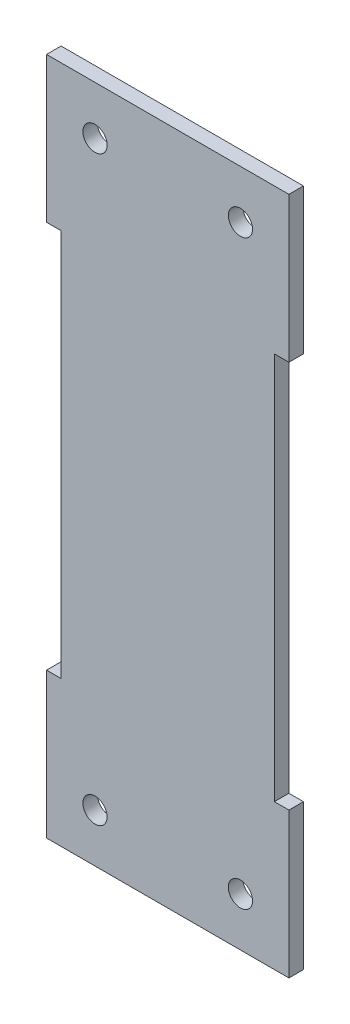
ISO-10303-21;
HEADER;
FILE_DESCRIPTION(('STEP AP214'),'2;1');
FILE_NAME('part.step','',(''),(''),'','','');
FILE_SCHEMA(('AUTOMOTIVE_DESIGN { 1 0 10303 214 1 1 1 1 }'));
ENDSEC;
DATA;
#1=APPLICATION_CONTEXT('core data for automotive mechanical design processes');
#2=APPLICATION_PROTOCOL_DEFINITION('international standard','automotive_design',2000,#1);
#3=PRODUCT_CONTEXT('',#1,'mechanical');
#4=PRODUCT('Part','Part','',(#3));
#5=PRODUCT_RELATED_PRODUCT_CATEGORY('part','',(#4));
#6=PRODUCT_DEFINITION_FORMATION('','',#4);
#7=PRODUCT_DEFINITION_CONTEXT('part definition',#1,'design');
#8=PRODUCT_DEFINITION('design','',#6,#7);
#9=PRODUCT_DEFINITION_SHAPE('','',#8);
#10=(LENGTH_UNIT() NAMED_UNIT(*) SI_UNIT(.MILLI.,.METRE.));
#11=(NAMED_UNIT(*) PLANE_ANGLE_UNIT() SI_UNIT($,.RADIAN.));
#12=(NAMED_UNIT(*) SI_UNIT($,.STERADIAN.) SOLID_ANGLE_UNIT());
#13=UNCERTAINTY_MEASURE_WITH_UNIT(LENGTH_MEASURE(1.E-05),#10,'distance_accuracy_value','');
#14=(GEOMETRIC_REPRESENTATION_CONTEXT(3) GLOBAL_UNCERTAINTY_ASSIGNED_CONTEXT((#13)) GLOBAL_UNIT_ASSIGNED_CONTEXT((#10,
#11,#12)) REPRESENTATION_CONTEXT('',''));
#15=CARTESIAN_POINT('',(0.,0.,0.));
#16=DIRECTION('',(0.,0.,1.));
#17=DIRECTION('',(1.,0.,0.));
#18=AXIS2_PLACEMENT_3D('',#15,#16,#17);
#19=CARTESIAN_POINT('',(0.,0.,3.));
#20=DIRECTION('',(0.,0.,1.));
#21=DIRECTION('',(1.,0.,0.));
#22=AXIS2_PLACEMENT_3D('',#19,#20,#21);
#23=PLANE('',#22);
#24=CARTESIAN_POINT('',(15.,-60.,3.));
#25=DIRECTION('',(0.,0.,1.));
#26=DIRECTION('',(-1.,0.,0.));
#27=AXIS2_PLACEMENT_3D('',#24,#25,#26);
#28=CIRCLE('',#27,2.5);
#29=CARTESIAN_POINT('',(12.5,-60.,3.));
#30=VERTEX_POINT('',#29);
#31=EDGE_CURVE('E332',#30,#30,#28,.T.);
#32=ORIENTED_EDGE('',*,*,#31,.F.);
#33=EDGE_LOOP('',(#32));
#34=FACE_BOUND('',#33,.T.);
#35=CARTESIAN_POINT('',(-15.,60.,3.));
#36=DIRECTION('',(0.,0.,1.));
#37=DIRECTION('',(1.,0.,0.));
#38=AXIS2_PLACEMENT_3D('',#35,#36,#37);
#39=CIRCLE('',#38,2.5);
#40=CARTESIAN_POINT('',(-12.5,60.,3.));
#41=VERTEX_POINT('',#40);
#42=EDGE_CURVE('E170',#41,#41,#39,.T.);
#43=ORIENTED_EDGE('',*,*,#42,.F.);
#44=EDGE_LOOP('',(#43));
#45=FACE_BOUND('',#44,.T.);
#46=DIRECTION('',(0.,-1.,0.));
#47=VECTOR('',#46,1.);
#48=CARTESIAN_POINT('',(-25.,40.,3.));
#49=LINE('',#48,#47);
#50=CARTESIAN_POINT('',(-25.,70.,3.));
#51=VERTEX_POINT('',#50);
#52=CARTESIAN_POINT('',(-25.,40.,3.));
#53=VERTEX_POINT('',#52);
#54=EDGE_CURVE('E200',#51,#53,#49,.T.);
#55=ORIENTED_EDGE('',*,*,#54,.T.);
#56=DIRECTION('',(1.,0.,0.));
#57=VECTOR('',#56,1.);
#58=CARTESIAN_POINT('',(-25.,40.,3.));
#59=LINE('',#58,#57);
#60=CARTESIAN_POINT('',(-22.,40.,3.));
#61=VERTEX_POINT('',#60);
#62=EDGE_CURVE('E112',#53,#61,#59,.T.);
#63=ORIENTED_EDGE('',*,*,#62,.T.);
#64=DIRECTION('',(0.,-1.,0.));
#65=VECTOR('',#64,1.);
#66=CARTESIAN_POINT('',(-22.,40.,3.));
#67=LINE('',#66,#65);
#68=CARTESIAN_POINT('',(-22.,-40.,3.));
#69=VERTEX_POINT('',#68);
#70=EDGE_CURVE('E237',#61,#69,#67,.T.);
#71=ORIENTED_EDGE('',*,*,#70,.T.);
#72=DIRECTION('',(-1.,0.,0.));
#73=VECTOR('',#72,1.);
#74=CARTESIAN_POINT('',(-22.,-40.,3.));
#75=LINE('',#74,#73);
#76=CARTESIAN_POINT('',(-25.,-40.,3.));
#77=VERTEX_POINT('',#76);
#78=EDGE_CURVE('E257',#69,#77,#75,.T.);
#79=ORIENTED_EDGE('',*,*,#78,.T.);
#80=DIRECTION('',(0.,-1.,0.));
#81=VECTOR('',#80,1.);
#82=CARTESIAN_POINT('',(-25.,-70.,3.));
#83=LINE('',#82,#81);
#84=CARTESIAN_POINT('',(-25.,-70.,3.));
#85=VERTEX_POINT('',#84);
#86=EDGE_CURVE('E253',#77,#85,#83,.T.);
#87=ORIENTED_EDGE('',*,*,#86,.T.);
#88=DIRECTION('',(1.,0.,0.));
#89=VECTOR('',#88,1.);
#90=CARTESIAN_POINT('',(25.,-70.,3.));
#91=LINE('',#90,#89);
#92=CARTESIAN_POINT('',(25.,-70.,3.));
#93=VERTEX_POINT('',#92);
#94=EDGE_CURVE('E256',#85,#93,#91,.T.);
#95=ORIENTED_EDGE('',*,*,#94,.T.);
#96=DIRECTION('',(0.,1.,0.));
#97=VECTOR('',#96,1.);
#98=CARTESIAN_POINT('',(25.,-70.,3.));
#99=LINE('',#98,#97);
#100=CARTESIAN_POINT('',(25.,-40.,3.));
#101=VERTEX_POINT('',#100);
#102=EDGE_CURVE('E261',#93,#101,#99,.T.);
#103=ORIENTED_EDGE('',*,*,#102,.T.);
#104=DIRECTION('',(-1.,0.,0.));
#105=VECTOR('',#104,1.);
#106=CARTESIAN_POINT('',(22.,-40.,3.));
#107=LINE('',#106,#105);
#108=CARTESIAN_POINT('',(22.,-40.,3.));
#109=VERTEX_POINT('',#108);
#110=EDGE_CURVE('E268',#101,#109,#107,.T.);
#111=ORIENTED_EDGE('',*,*,#110,.T.);
#112=DIRECTION('',(0.,1.,0.));
#113=VECTOR('',#112,1.);
#114=CARTESIAN_POINT('',(22.,40.,3.));
#115=LINE('',#114,#113);
#116=CARTESIAN_POINT('',(22.,40.,3.));
#117=VERTEX_POINT('',#116);
#118=EDGE_CURVE('E143',#109,#117,#115,.T.);
#119=ORIENTED_EDGE('',*,*,#118,.T.);
#120=DIRECTION('',(1.,0.,0.));
#121=VECTOR('',#120,1.);
#122=CARTESIAN_POINT('',(25.,40.,3.));
#123=LINE('',#122,#121);
#124=CARTESIAN_POINT('',(25.,40.,3.));
#125=VERTEX_POINT('',#124);
#126=EDGE_CURVE('E137',#117,#125,#123,.T.);
#127=ORIENTED_EDGE('',*,*,#126,.T.);
#128=DIRECTION('',(0.,1.,0.));
#129=VECTOR('',#128,1.);
#130=CARTESIAN_POINT('',(25.,40.,3.));
#131=LINE('',#130,#129);
#132=CARTESIAN_POINT('',(25.,70.,3.));
#133=VERTEX_POINT('',#132);
#134=EDGE_CURVE('E141',#125,#133,#131,.T.);
#135=ORIENTED_EDGE('',*,*,#134,.T.);
#136=DIRECTION('',(-1.,0.,0.));
#137=VECTOR('',#136,1.);
#138=CARTESIAN_POINT('',(25.,70.,3.));
#139=LINE('',#138,#137);
#140=EDGE_CURVE('E57',#133,#51,#139,.T.);
#141=ORIENTED_EDGE('',*,*,#140,.T.);
#142=EDGE_LOOP('',(#55,#63,#71,#79,#87,#95,#103,#111,#119,#127,#135,#141));
#143=FACE_BOUND('',#142,.T.);
#144=CARTESIAN_POINT('',(15.,60.,3.));
#145=DIRECTION('',(0.,0.,1.));
#146=DIRECTION('',(1.,0.,0.));
#147=AXIS2_PLACEMENT_3D('',#144,#145,#146);
#148=CIRCLE('',#147,2.5);
#149=CARTESIAN_POINT('',(17.5,60.,3.));
#150=VERTEX_POINT('',#149);
#151=EDGE_CURVE('E340',#150,#150,#148,.T.);
#152=ORIENTED_EDGE('',*,*,#151,.F.);
#153=EDGE_LOOP('',(#152));
#154=FACE_BOUND('',#153,.T.);
#155=CARTESIAN_POINT('',(-15.,-60.,3.));
#156=DIRECTION('',(0.,0.,1.));
#157=DIRECTION('',(-1.,0.,0.));
#158=AXIS2_PLACEMENT_3D('',#155,#156,#157);
#159=CIRCLE('',#158,2.5);
#160=CARTESIAN_POINT('',(-17.5,-60.,3.));
#161=VERTEX_POINT('',#160);
#162=EDGE_CURVE('E321',#161,#161,#159,.T.);
#163=ORIENTED_EDGE('',*,*,#162,.F.);
#164=EDGE_LOOP('',(#163));
#165=FACE_BOUND('',#164,.T.);
#166=ADVANCED_FACE('F39',(#34,#45,#143,#154,#165),#23,.T.);
#167=CARTESIAN_POINT('',(0.,0.,0.));
#168=DIRECTION('',(0.,0.,1.));
#169=DIRECTION('',(1.,0.,0.));
#170=AXIS2_PLACEMENT_3D('',#167,#168,#169);
#171=PLANE('',#170);
#172=DIRECTION('',(0.,-1.,0.));
#173=VECTOR('',#172,1.);
#174=CARTESIAN_POINT('',(-25.,40.,0.));
#175=LINE('',#174,#173);
#176=CARTESIAN_POINT('',(-25.,70.,0.));
#177=VERTEX_POINT('',#176);
#178=CARTESIAN_POINT('',(-25.,40.,0.));
#179=VERTEX_POINT('',#178);
#180=EDGE_CURVE('E165',#177,#179,#175,.T.);
#181=ORIENTED_EDGE('',*,*,#180,.F.);
#182=DIRECTION('',(-1.,0.,0.));
#183=VECTOR('',#182,1.);
#184=CARTESIAN_POINT('',(25.,70.,0.));
#185=LINE('',#184,#183);
#186=CARTESIAN_POINT('',(25.,70.,0.));
#187=VERTEX_POINT('',#186);
#188=EDGE_CURVE('E104',#187,#177,#185,.T.);
#189=ORIENTED_EDGE('',*,*,#188,.F.);
#190=DIRECTION('',(0.,1.,0.));
#191=VECTOR('',#190,1.);
#192=CARTESIAN_POINT('',(25.,40.,0.));
#193=LINE('',#192,#191);
#194=CARTESIAN_POINT('',(25.,40.,0.));
#195=VERTEX_POINT('',#194);
#196=EDGE_CURVE('E98',#195,#187,#193,.T.);
#197=ORIENTED_EDGE('',*,*,#196,.F.);
#198=DIRECTION('',(1.,0.,0.));
#199=VECTOR('',#198,1.);
#200=CARTESIAN_POINT('',(25.,40.,0.));
#201=LINE('',#200,#199);
#202=CARTESIAN_POINT('',(22.,40.,0.));
#203=VERTEX_POINT('',#202);
#204=EDGE_CURVE('E152',#203,#195,#201,.T.);
#205=ORIENTED_EDGE('',*,*,#204,.F.);
#206=DIRECTION('',(0.,1.,0.));
#207=VECTOR('',#206,1.);
#208=CARTESIAN_POINT('',(22.,40.,0.));
#209=LINE('',#208,#207);
#210=CARTESIAN_POINT('',(22.,-40.,0.));
#211=VERTEX_POINT('',#210);
#212=EDGE_CURVE('E191',#211,#203,#209,.T.);
#213=ORIENTED_EDGE('',*,*,#212,.F.);
#214=DIRECTION('',(-1.,0.,0.));
#215=VECTOR('',#214,1.);
#216=CARTESIAN_POINT('',(22.,-40.,0.));
#217=LINE('',#216,#215);
#218=CARTESIAN_POINT('',(25.,-40.,0.));
#219=VERTEX_POINT('',#218);
#220=EDGE_CURVE('E188',#219,#211,#217,.T.);
#221=ORIENTED_EDGE('',*,*,#220,.F.);
#222=DIRECTION('',(0.,1.,0.));
#223=VECTOR('',#222,1.);
#224=CARTESIAN_POINT('',(25.,-70.,0.));
#225=LINE('',#224,#223);
#226=CARTESIAN_POINT('',(25.,-70.,0.));
#227=VERTEX_POINT('',#226);
#228=EDGE_CURVE('E185',#227,#219,#225,.T.);
#229=ORIENTED_EDGE('',*,*,#228,.F.);
#230=DIRECTION('',(1.,0.,0.));
#231=VECTOR('',#230,1.);
#232=CARTESIAN_POINT('',(25.,-70.,0.));
#233=LINE('',#232,#231);
#234=CARTESIAN_POINT('',(-25.,-70.,0.));
#235=VERTEX_POINT('',#234);
#236=EDGE_CURVE('E182',#235,#227,#233,.T.);
#237=ORIENTED_EDGE('',*,*,#236,.F.);
#238=DIRECTION('',(0.,-1.,0.));
#239=VECTOR('',#238,1.);
#240=CARTESIAN_POINT('',(-25.,-70.,0.));
#241=LINE('',#240,#239);
#242=CARTESIAN_POINT('',(-25.,-40.,0.));
#243=VERTEX_POINT('',#242);
#244=EDGE_CURVE('E179',#243,#235,#241,.T.);
#245=ORIENTED_EDGE('',*,*,#244,.F.);
#246=DIRECTION('',(-1.,0.,0.));
#247=VECTOR('',#246,1.);
#248=CARTESIAN_POINT('',(-22.,-40.,0.));
#249=LINE('',#248,#247);
#250=CARTESIAN_POINT('',(-22.,-40.,0.));
#251=VERTEX_POINT('',#250);
#252=EDGE_CURVE('E176',#251,#243,#249,.T.);
#253=ORIENTED_EDGE('',*,*,#252,.F.);
#254=DIRECTION('',(0.,-1.,0.));
#255=VECTOR('',#254,1.);
#256=CARTESIAN_POINT('',(-22.,40.,0.));
#257=LINE('',#256,#255);
#258=CARTESIAN_POINT('',(-22.,40.,0.));
#259=VERTEX_POINT('',#258);
#260=EDGE_CURVE('E173',#259,#251,#257,.T.);
#261=ORIENTED_EDGE('',*,*,#260,.F.);
#262=DIRECTION('',(1.,0.,0.));
#263=VECTOR('',#262,1.);
#264=CARTESIAN_POINT('',(-25.,40.,0.));
#265=LINE('',#264,#263);
#266=EDGE_CURVE('E169',#179,#259,#265,.T.);
#267=ORIENTED_EDGE('',*,*,#266,.F.);
#268=EDGE_LOOP('',(#181,#189,#197,#205,#213,#221,#229,#237,#245,#253,#261,#267));
#269=FACE_BOUND('',#268,.T.);
#270=CARTESIAN_POINT('',(-15.,60.,0.));
#271=DIRECTION('',(0.,0.,1.));
#272=DIRECTION('',(1.,0.,0.));
#273=AXIS2_PLACEMENT_3D('',#270,#271,#272);
#274=CIRCLE('',#273,2.5);
#275=CARTESIAN_POINT('',(-12.5,60.,0.));
#276=VERTEX_POINT('',#275);
#277=EDGE_CURVE('E344',#276,#276,#274,.T.);
#278=ORIENTED_EDGE('',*,*,#277,.T.);
#279=EDGE_LOOP('',(#278));
#280=FACE_BOUND('',#279,.T.);
#281=CARTESIAN_POINT('',(15.,60.,0.));
#282=DIRECTION('',(0.,0.,1.));
#283=DIRECTION('',(1.,0.,0.));
#284=AXIS2_PLACEMENT_3D('',#281,#282,#283);
#285=CIRCLE('',#284,2.5);
#286=CARTESIAN_POINT('',(17.5,60.,0.));
#287=VERTEX_POINT('',#286);
#288=EDGE_CURVE('E336',#287,#287,#285,.T.);
#289=ORIENTED_EDGE('',*,*,#288,.T.);
#290=EDGE_LOOP('',(#289));
#291=FACE_BOUND('',#290,.T.);
#292=CARTESIAN_POINT('',(15.,-60.,0.));
#293=DIRECTION('',(0.,0.,1.));
#294=DIRECTION('',(-1.,0.,0.));
#295=AXIS2_PLACEMENT_3D('',#292,#293,#294);
#296=CIRCLE('',#295,2.5);
#297=CARTESIAN_POINT('',(12.5,-60.,0.));
#298=VERTEX_POINT('',#297);
#299=EDGE_CURVE('E329',#298,#298,#296,.T.);
#300=ORIENTED_EDGE('',*,*,#299,.T.);
#301=EDGE_LOOP('',(#300));
#302=FACE_BOUND('',#301,.T.);
#303=CARTESIAN_POINT('',(-15.,-60.,0.));
#304=DIRECTION('',(0.,0.,1.));
#305=DIRECTION('',(-1.,0.,0.));
#306=AXIS2_PLACEMENT_3D('',#303,#304,#305);
#307=CIRCLE('',#306,2.5);
#308=CARTESIAN_POINT('',(-17.5,-60.,0.));
#309=VERTEX_POINT('',#308);
#310=EDGE_CURVE('E324',#309,#309,#307,.T.);
#311=ORIENTED_EDGE('',*,*,#310,.T.);
#312=EDGE_LOOP('',(#311));
#313=FACE_BOUND('',#312,.T.);
#314=ADVANCED_FACE('F241',(#269,#280,#291,#302,#313),#171,.F.);
#315=CARTESIAN_POINT('',(-25.,40.,3.));
#316=DIRECTION('',(1.,0.,0.));
#317=DIRECTION('',(0.,0.,-1.));
#318=AXIS2_PLACEMENT_3D('',#315,#316,#317);
#319=PLANE('',#318);
#320=ORIENTED_EDGE('',*,*,#180,.T.);
#321=DIRECTION('',(0.,0.,-1.));
#322=VECTOR('',#321,1.);
#323=CARTESIAN_POINT('',(-25.,40.,3.));
#324=LINE('',#323,#322);
#325=EDGE_CURVE('E11',#53,#179,#324,.T.);
#326=ORIENTED_EDGE('',*,*,#325,.F.);
#327=ORIENTED_EDGE('',*,*,#54,.F.);
#328=DIRECTION('',(0.,0.,-1.));
#329=VECTOR('',#328,1.);
#330=CARTESIAN_POINT('',(-25.,70.,3.));
#331=LINE('',#330,#329);
#332=EDGE_CURVE('E161',#51,#177,#331,.T.);
#333=ORIENTED_EDGE('',*,*,#332,.T.);
#334=EDGE_LOOP('',(#320,#326,#327,#333));
#335=FACE_BOUND('',#334,.T.);
#336=ADVANCED_FACE('F41',(#335),#319,.F.);
#337=CARTESIAN_POINT('',(-25.,40.,3.));
#338=DIRECTION('',(0.,1.,0.));
#339=DIRECTION('',(0.,0.,1.));
#340=AXIS2_PLACEMENT_3D('',#337,#338,#339);
#341=PLANE('',#340);
#342=ORIENTED_EDGE('',*,*,#266,.T.);
#343=DIRECTION('',(0.,0.,-1.));
#344=VECTOR('',#343,1.);
#345=CARTESIAN_POINT('',(-22.,40.,3.));
#346=LINE('',#345,#344);
#347=EDGE_CURVE('E49',#61,#259,#346,.T.);
#348=ORIENTED_EDGE('',*,*,#347,.F.);
#349=ORIENTED_EDGE('',*,*,#62,.F.);
#350=ORIENTED_EDGE('',*,*,#325,.T.);
#351=EDGE_LOOP('',(#342,#348,#349,#350));
#352=FACE_BOUND('',#351,.T.);
#353=ADVANCED_FACE('F460',(#352),#341,.F.);
#354=CARTESIAN_POINT('',(-22.,40.,3.));
#355=DIRECTION('',(1.,0.,0.));
#356=DIRECTION('',(0.,1.,0.));
#357=AXIS2_PLACEMENT_3D('',#354,#355,#356);
#358=PLANE('',#357);
#359=ORIENTED_EDGE('',*,*,#260,.T.);
#360=DIRECTION('',(0.,0.,-1.));
#361=VECTOR('',#360,1.);
#362=CARTESIAN_POINT('',(-22.,-40.,3.));
#363=LINE('',#362,#361);
#364=EDGE_CURVE('E227',#69,#251,#363,.T.);
#365=ORIENTED_EDGE('',*,*,#364,.F.);
#366=ORIENTED_EDGE('',*,*,#70,.F.);
#367=ORIENTED_EDGE('',*,*,#347,.T.);
#368=EDGE_LOOP('',(#359,#365,#366,#367));
#369=FACE_BOUND('',#368,.T.);
#370=ADVANCED_FACE('F235',(#369),#358,.F.);
#371=CARTESIAN_POINT('',(-22.,-40.,3.));
#372=DIRECTION('',(0.,-1.,0.));
#373=DIRECTION('',(0.,0.,-1.));
#374=AXIS2_PLACEMENT_3D('',#371,#372,#373);
#375=PLANE('',#374);
#376=ORIENTED_EDGE('',*,*,#252,.T.);
#377=DIRECTION('',(0.,0.,-1.));
#378=VECTOR('',#377,1.);
#379=CARTESIAN_POINT('',(-25.,-40.,3.));
#380=LINE('',#379,#378);
#381=EDGE_CURVE('E223',#77,#243,#380,.T.);
#382=ORIENTED_EDGE('',*,*,#381,.F.);
#383=ORIENTED_EDGE('',*,*,#78,.F.);
#384=ORIENTED_EDGE('',*,*,#364,.T.);
#385=EDGE_LOOP('',(#376,#382,#383,#384));
#386=FACE_BOUND('',#385,.T.);
#387=ADVANCED_FACE('F247',(#386),#375,.F.);
#388=CARTESIAN_POINT('',(-25.,-70.,3.));
#389=DIRECTION('',(1.,0.,0.));
#390=DIRECTION('',(0.,0.,-1.));
#391=AXIS2_PLACEMENT_3D('',#388,#389,#390);
#392=PLANE('',#391);
#393=ORIENTED_EDGE('',*,*,#244,.T.);
#394=DIRECTION('',(0.,0.,-1.));
#395=VECTOR('',#394,1.);
#396=CARTESIAN_POINT('',(-25.,-70.,3.));
#397=LINE('',#396,#395);
#398=EDGE_CURVE('E219',#85,#235,#397,.T.);
#399=ORIENTED_EDGE('',*,*,#398,.F.);
#400=ORIENTED_EDGE('',*,*,#86,.F.);
#401=ORIENTED_EDGE('',*,*,#381,.T.);
#402=EDGE_LOOP('',(#393,#399,#400,#401));
#403=FACE_BOUND('',#402,.T.);
#404=ADVANCED_FACE('F251',(#403),#392,.F.);
#405=CARTESIAN_POINT('',(25.,-70.,3.));
#406=DIRECTION('',(0.,1.,0.));
#407=DIRECTION('',(-1.,0.,0.));
#408=AXIS2_PLACEMENT_3D('',#405,#406,#407);
#409=PLANE('',#408);
#410=ORIENTED_EDGE('',*,*,#236,.T.);
#411=DIRECTION('',(0.,0.,-1.));
#412=VECTOR('',#411,1.);
#413=CARTESIAN_POINT('',(25.,-70.,3.));
#414=LINE('',#413,#412);
#415=EDGE_CURVE('E215',#93,#227,#414,.T.);
#416=ORIENTED_EDGE('',*,*,#415,.F.);
#417=ORIENTED_EDGE('',*,*,#94,.F.);
#418=ORIENTED_EDGE('',*,*,#398,.T.);
#419=EDGE_LOOP('',(#410,#416,#417,#418));
#420=FACE_BOUND('',#419,.T.);
#421=ADVANCED_FACE('F425',(#420),#409,.F.);
#422=CARTESIAN_POINT('',(25.,-70.,3.));
#423=DIRECTION('',(-1.,0.,0.));
#424=DIRECTION('',(0.,0.,1.));
#425=AXIS2_PLACEMENT_3D('',#422,#423,#424);
#426=PLANE('',#425);
#427=ORIENTED_EDGE('',*,*,#228,.T.);
#428=DIRECTION('',(0.,0.,-1.));
#429=VECTOR('',#428,1.);
#430=CARTESIAN_POINT('',(25.,-40.,3.));
#431=LINE('',#430,#429);
#432=EDGE_CURVE('E211',#101,#219,#431,.T.);
#433=ORIENTED_EDGE('',*,*,#432,.F.);
#434=ORIENTED_EDGE('',*,*,#102,.F.);
#435=ORIENTED_EDGE('',*,*,#415,.T.);
#436=EDGE_LOOP('',(#427,#433,#434,#435));
#437=FACE_BOUND('',#436,.T.);
#438=ADVANCED_FACE('F416',(#437),#426,.F.);
#439=CARTESIAN_POINT('',(22.,-40.,3.));
#440=DIRECTION('',(0.,-1.,0.));
#441=DIRECTION('',(0.,0.,-1.));
#442=AXIS2_PLACEMENT_3D('',#439,#440,#441);
#443=PLANE('',#442);
#444=ORIENTED_EDGE('',*,*,#220,.T.);
#445=DIRECTION('',(0.,0.,-1.));
#446=VECTOR('',#445,1.);
#447=CARTESIAN_POINT('',(22.,-40.,3.));
#448=LINE('',#447,#446);
#449=EDGE_CURVE('E207',#109,#211,#448,.T.);
#450=ORIENTED_EDGE('',*,*,#449,.F.);
#451=ORIENTED_EDGE('',*,*,#110,.F.);
#452=ORIENTED_EDGE('',*,*,#432,.T.);
#453=EDGE_LOOP('',(#444,#450,#451,#452));
#454=FACE_BOUND('',#453,.T.);
#455=ADVANCED_FACE('F276',(#454),#443,.F.);
#456=CARTESIAN_POINT('',(22.,40.,3.));
#457=DIRECTION('',(-1.,0.,0.));
#458=DIRECTION('',(0.,-1.,0.));
#459=AXIS2_PLACEMENT_3D('',#456,#457,#458);
#460=PLANE('',#459);
#461=ORIENTED_EDGE('',*,*,#212,.T.);
#462=DIRECTION('',(0.,0.,-1.));
#463=VECTOR('',#462,1.);
#464=CARTESIAN_POINT('',(22.,40.,3.));
#465=LINE('',#464,#463);
#466=EDGE_CURVE('E154',#117,#203,#465,.T.);
#467=ORIENTED_EDGE('',*,*,#466,.F.);
#468=ORIENTED_EDGE('',*,*,#118,.F.);
#469=ORIENTED_EDGE('',*,*,#449,.T.);
#470=EDGE_LOOP('',(#461,#467,#468,#469));
#471=FACE_BOUND('',#470,.T.);
#472=ADVANCED_FACE('F280',(#471),#460,.F.);
#473=CARTESIAN_POINT('',(25.,40.,3.));
#474=DIRECTION('',(0.,1.,0.));
#475=DIRECTION('',(0.,0.,1.));
#476=AXIS2_PLACEMENT_3D('',#473,#474,#475);
#477=PLANE('',#476);
#478=ORIENTED_EDGE('',*,*,#204,.T.);
#479=DIRECTION('',(0.,0.,-1.));
#480=VECTOR('',#479,1.);
#481=CARTESIAN_POINT('',(25.,40.,3.));
#482=LINE('',#481,#480);
#483=EDGE_CURVE('E149',#125,#195,#482,.T.);
#484=ORIENTED_EDGE('',*,*,#483,.F.);
#485=ORIENTED_EDGE('',*,*,#126,.F.);
#486=ORIENTED_EDGE('',*,*,#466,.T.);
#487=EDGE_LOOP('',(#478,#484,#485,#486));
#488=FACE_BOUND('',#487,.T.);
#489=ADVANCED_FACE('F150',(#488),#477,.F.);
#490=CARTESIAN_POINT('',(25.,40.,3.));
#491=DIRECTION('',(-1.,0.,0.));
#492=DIRECTION('',(0.,0.,1.));
#493=AXIS2_PLACEMENT_3D('',#490,#491,#492);
#494=PLANE('',#493);
#495=ORIENTED_EDGE('',*,*,#196,.T.);
#496=DIRECTION('',(0.,0.,-1.));
#497=VECTOR('',#496,1.);
#498=CARTESIAN_POINT('',(25.,70.,3.));
#499=LINE('',#498,#497);
#500=EDGE_CURVE('E155',#133,#187,#499,.T.);
#501=ORIENTED_EDGE('',*,*,#500,.F.);
#502=ORIENTED_EDGE('',*,*,#134,.F.);
#503=ORIENTED_EDGE('',*,*,#483,.T.);
#504=EDGE_LOOP('',(#495,#501,#502,#503));
#505=FACE_BOUND('',#504,.T.);
#506=ADVANCED_FACE('F157',(#505),#494,.F.);
#507=CARTESIAN_POINT('',(25.,70.,3.));
#508=DIRECTION('',(0.,-1.,0.));
#509=DIRECTION('',(0.,0.,-1.));
#510=AXIS2_PLACEMENT_3D('',#507,#508,#509);
#511=PLANE('',#510);
#512=ORIENTED_EDGE('',*,*,#188,.T.);
#513=ORIENTED_EDGE('',*,*,#332,.F.);
#514=ORIENTED_EDGE('',*,*,#140,.F.);
#515=ORIENTED_EDGE('',*,*,#500,.T.);
#516=EDGE_LOOP('',(#512,#513,#514,#515));
#517=FACE_BOUND('',#516,.T.);
#518=ADVANCED_FACE('F284',(#517),#511,.F.);
#519=CARTESIAN_POINT('',(-15.,60.,3.));
#520=DIRECTION('',(0.,0.,-1.));
#521=DIRECTION('',(-1.,0.,0.));
#522=AXIS2_PLACEMENT_3D('',#519,#520,#521);
#523=CYLINDRICAL_SURFACE('',#522,2.5);
#524=ORIENTED_EDGE('',*,*,#42,.T.);
#525=EDGE_LOOP('',(#524));
#526=FACE_BOUND('',#525,.T.);
#527=ORIENTED_EDGE('',*,*,#277,.F.);
#528=EDGE_LOOP('',(#527));
#529=FACE_BOUND('',#528,.T.);
#530=ADVANCED_FACE('F286',(#526,#529),#523,.F.);
#531=CARTESIAN_POINT('',(15.,60.,3.));
#532=DIRECTION('',(0.,0.,-1.));
#533=DIRECTION('',(-1.,0.,0.));
#534=AXIS2_PLACEMENT_3D('',#531,#532,#533);
#535=CYLINDRICAL_SURFACE('',#534,2.5);
#536=ORIENTED_EDGE('',*,*,#151,.T.);
#537=EDGE_LOOP('',(#536));
#538=FACE_BOUND('',#537,.T.);
#539=ORIENTED_EDGE('',*,*,#288,.F.);
#540=EDGE_LOOP('',(#539));
#541=FACE_BOUND('',#540,.T.);
#542=ADVANCED_FACE('F292',(#538,#541),#535,.F.);
#543=CARTESIAN_POINT('',(15.,-60.,3.));
#544=DIRECTION('',(0.,0.,-1.));
#545=DIRECTION('',(-1.,0.,0.));
#546=AXIS2_PLACEMENT_3D('',#543,#544,#545);
#547=CYLINDRICAL_SURFACE('',#546,2.5);
#548=ORIENTED_EDGE('',*,*,#31,.T.);
#549=EDGE_LOOP('',(#548));
#550=FACE_BOUND('',#549,.T.);
#551=ORIENTED_EDGE('',*,*,#299,.F.);
#552=EDGE_LOOP('',(#551));
#553=FACE_BOUND('',#552,.T.);
#554=ADVANCED_FACE('F308',(#550,#553),#547,.F.);
#555=CARTESIAN_POINT('',(-15.,-60.,3.));
#556=DIRECTION('',(0.,0.,-1.));
#557=DIRECTION('',(-1.,0.,0.));
#558=AXIS2_PLACEMENT_3D('',#555,#556,#557);
#559=CYLINDRICAL_SURFACE('',#558,2.5);
#560=ORIENTED_EDGE('',*,*,#162,.T.);
#561=EDGE_LOOP('',(#560));
#562=FACE_BOUND('',#561,.T.);
#563=ORIENTED_EDGE('',*,*,#310,.F.);
#564=EDGE_LOOP('',(#563));
#565=FACE_BOUND('',#564,.T.);
#566=ADVANCED_FACE('F312',(#562,#565),#559,.F.);
#567=CLOSED_SHELL('',(#166,#314,#336,#353,#370,#387,#404,#421,#438,#455,#472,#489,#506,#518,
#530,#542,#554,#566));
#568=MANIFOLD_SOLID_BREP('B2',#567);
#569=ADVANCED_BREP_SHAPE_REPRESENTATION('',(#18,#568),#14);
#570=SHAPE_DEFINITION_REPRESENTATION(#9,#569);
ENDSEC;
END-ISO-10303-21;
